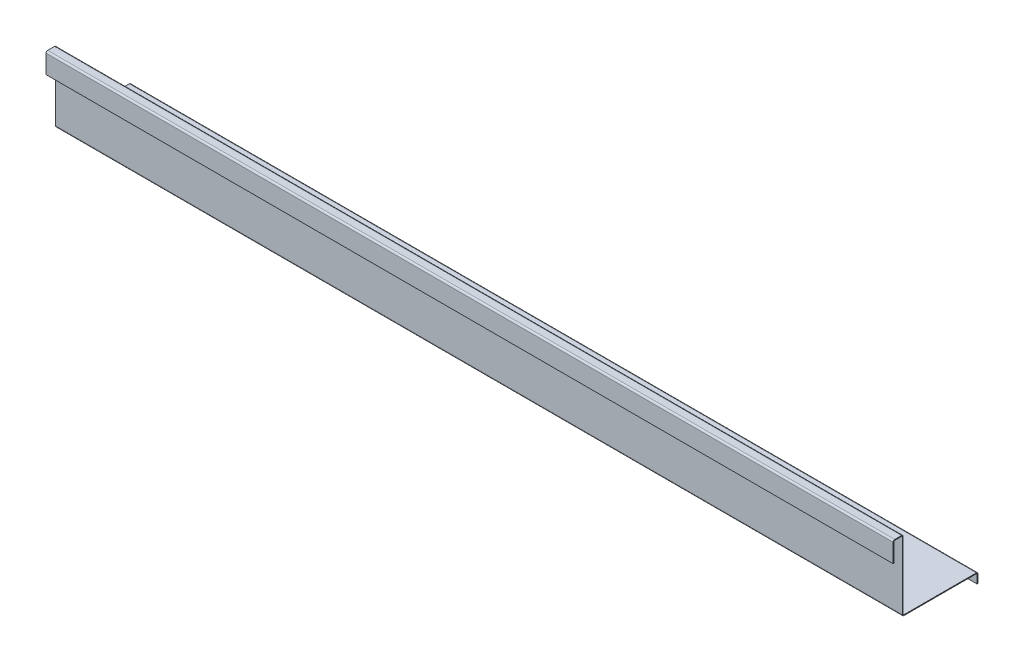
ISO-10303-21;
HEADER;
FILE_DESCRIPTION(('STEP AP214'),'2;1');
FILE_NAME('part.step','',(''),(''),'','','');
FILE_SCHEMA(('AUTOMOTIVE_DESIGN { 1 0 10303 214 1 1 1 1 }'));
ENDSEC;
DATA;
#1=APPLICATION_CONTEXT('core data for automotive mechanical design processes');
#2=APPLICATION_PROTOCOL_DEFINITION('international standard','automotive_design',2000,#1);
#3=PRODUCT_CONTEXT('',#1,'mechanical');
#4=PRODUCT('Part','Part','',(#3));
#5=PRODUCT_RELATED_PRODUCT_CATEGORY('part','',(#4));
#6=PRODUCT_DEFINITION_FORMATION('','',#4);
#7=PRODUCT_DEFINITION_CONTEXT('part definition',#1,'design');
#8=PRODUCT_DEFINITION('design','',#6,#7);
#9=PRODUCT_DEFINITION_SHAPE('','',#8);
#10=(LENGTH_UNIT() NAMED_UNIT(*) SI_UNIT(.MILLI.,.METRE.));
#11=(NAMED_UNIT(*) PLANE_ANGLE_UNIT() SI_UNIT($,.RADIAN.));
#12=(NAMED_UNIT(*) SI_UNIT($,.STERADIAN.) SOLID_ANGLE_UNIT());
#13=UNCERTAINTY_MEASURE_WITH_UNIT(LENGTH_MEASURE(1.E-05),#10,'distance_accuracy_value','');
#14=(GEOMETRIC_REPRESENTATION_CONTEXT(3) GLOBAL_UNCERTAINTY_ASSIGNED_CONTEXT((#13)) GLOBAL_UNIT_ASSIGNED_CONTEXT((#10,
#11,#12)) REPRESENTATION_CONTEXT('',''));
#15=CARTESIAN_POINT('',(0.,0.,0.));
#16=DIRECTION('',(0.,0.,1.));
#17=DIRECTION('',(1.,0.,0.));
#18=AXIS2_PLACEMENT_3D('',#15,#16,#17);
#19=CARTESIAN_POINT('',(420.,-0.8,37.5));
#20=DIRECTION('',(1.,0.,0.));
#21=DIRECTION('',(0.,0.,-1.));
#22=AXIS2_PLACEMENT_3D('',#19,#20,#21);
#23=PLANE('',#22);
#24=DIRECTION('',(0.,0.,-1.));
#25=VECTOR('',#24,1.);
#26=CARTESIAN_POINT('',(420.,-0.8,37.5));
#27=LINE('',#26,#25);
#28=CARTESIAN_POINT('',(420.,-0.8,35.9));
#29=VERTEX_POINT('',#28);
#30=CARTESIAN_POINT('',(420.,-0.8,-35.9));
#31=VERTEX_POINT('',#30);
#32=EDGE_CURVE('E121',#29,#31,#27,.T.);
#33=ORIENTED_EDGE('',*,*,#32,.T.);
#34=DIRECTION('',(0.,1.,0.));
#35=VECTOR('',#34,1.);
#36=CARTESIAN_POINT('',(420.,-0.800000000000008,-35.9));
#37=LINE('',#36,#35);
#38=CARTESIAN_POINT('',(420.,0.,-35.9));
#39=VERTEX_POINT('',#38);
#40=EDGE_CURVE('E300',#31,#39,#37,.T.);
#41=ORIENTED_EDGE('',*,*,#40,.T.);
#42=DIRECTION('',(0.,0.,-1.));
#43=VECTOR('',#42,1.);
#44=CARTESIAN_POINT('',(420.,0.,37.5));
#45=LINE('',#44,#43);
#46=CARTESIAN_POINT('',(420.,0.,35.9));
#47=VERTEX_POINT('',#46);
#48=EDGE_CURVE('E456',#47,#39,#45,.T.);
#49=ORIENTED_EDGE('',*,*,#48,.F.);
#50=DIRECTION('',(0.,-1.,0.));
#51=VECTOR('',#50,1.);
#52=CARTESIAN_POINT('',(420.,0.,35.9));
#53=LINE('',#52,#51);
#54=EDGE_CURVE('E442',#47,#29,#53,.T.);
#55=ORIENTED_EDGE('',*,*,#54,.T.);
#56=EDGE_LOOP('',(#33,#41,#49,#55));
#57=FACE_BOUND('',#56,.T.);
#58=ADVANCED_FACE('F113',(#57),#23,.T.);
#59=CARTESIAN_POINT('',(420.,-0.8,-37.5));
#60=DIRECTION('',(0.,-1.,0.));
#61=DIRECTION('',(0.,0.,-1.));
#62=AXIS2_PLACEMENT_3D('',#59,#60,#61);
#63=PLANE('',#62);
#64=DIRECTION('',(0.,0.,1.));
#65=VECTOR('',#64,1.);
#66=CARTESIAN_POINT('',(-420.,-0.8,37.5));
#67=LINE('',#66,#65);
#68=CARTESIAN_POINT('',(-420.,-0.8,-35.9));
#69=VERTEX_POINT('',#68);
#70=CARTESIAN_POINT('',(-420.,-0.8,35.9));
#71=VERTEX_POINT('',#70);
#72=EDGE_CURVE('E13',#69,#71,#67,.T.);
#73=ORIENTED_EDGE('',*,*,#72,.F.);
#74=DIRECTION('',(1.,0.,0.));
#75=VECTOR('',#74,1.);
#76=CARTESIAN_POINT('',(420.,-0.800000000000008,-35.9));
#77=LINE('',#76,#75);
#78=EDGE_CURVE('E129',#31,#69,#77,.F.);
#79=ORIENTED_EDGE('',*,*,#78,.F.);
#80=ORIENTED_EDGE('',*,*,#32,.F.);
#81=DIRECTION('',(1.,0.,0.));
#82=VECTOR('',#81,1.);
#83=CARTESIAN_POINT('',(420.,-0.8,35.9));
#84=LINE('',#83,#82);
#85=EDGE_CURVE('E435',#29,#71,#84,.F.);
#86=ORIENTED_EDGE('',*,*,#85,.T.);
#87=EDGE_LOOP('',(#73,#79,#80,#86));
#88=FACE_BOUND('',#87,.T.);
#89=ADVANCED_FACE('F540',(#88),#63,.T.);
#90=CARTESIAN_POINT('',(420.,0.,-37.5));
#91=DIRECTION('',(0.,-1.,0.));
#92=DIRECTION('',(0.,0.,-1.));
#93=AXIS2_PLACEMENT_3D('',#90,#91,#92);
#94=PLANE('',#93);
#95=DIRECTION('',(1.,0.,0.));
#96=VECTOR('',#95,1.);
#97=CARTESIAN_POINT('',(420.,0.,-35.9));
#98=LINE('',#97,#96);
#99=CARTESIAN_POINT('',(-420.,0.,-35.9));
#100=VERTEX_POINT('',#99);
#101=EDGE_CURVE('E293',#39,#100,#98,.F.);
#102=ORIENTED_EDGE('',*,*,#101,.T.);
#103=DIRECTION('',(0.,0.,1.));
#104=VECTOR('',#103,1.);
#105=CARTESIAN_POINT('',(-420.,0.,37.5));
#106=LINE('',#105,#104);
#107=CARTESIAN_POINT('',(-420.,0.,35.9));
#108=VERTEX_POINT('',#107);
#109=EDGE_CURVE('E116',#100,#108,#106,.T.);
#110=ORIENTED_EDGE('',*,*,#109,.T.);
#111=DIRECTION('',(1.,0.,0.));
#112=VECTOR('',#111,1.);
#113=CARTESIAN_POINT('',(420.,0.,35.9));
#114=LINE('',#113,#112);
#115=EDGE_CURVE('E448',#47,#108,#114,.F.);
#116=ORIENTED_EDGE('',*,*,#115,.F.);
#117=ORIENTED_EDGE('',*,*,#48,.T.);
#118=EDGE_LOOP('',(#102,#110,#116,#117));
#119=FACE_BOUND('',#118,.T.);
#120=ADVANCED_FACE('F462',(#119),#94,.F.);
#121=CARTESIAN_POINT('',(-420.,69.2,37.5));
#122=DIRECTION('',(-1.,0.,0.));
#123=DIRECTION('',(0.,0.,1.));
#124=AXIS2_PLACEMENT_3D('',#121,#122,#123);
#125=PLANE('',#124);
#126=DIRECTION('',(0.,0.,1.));
#127=VECTOR('',#126,1.);
#128=CARTESIAN_POINT('',(-420.,68.4,37.5));
#129=LINE('',#128,#127);
#130=CARTESIAN_POINT('',(-420.,68.4000000000001,45.1));
#131=VERTEX_POINT('',#130);
#132=CARTESIAN_POINT('',(-420.,68.4,38.3));
#133=VERTEX_POINT('',#132);
#134=EDGE_CURVE('E375',#131,#133,#129,.F.);
#135=ORIENTED_EDGE('',*,*,#134,.F.);
#136=DIRECTION('',(0.,1.,0.));
#137=VECTOR('',#136,1.);
#138=CARTESIAN_POINT('',(-420.,68.4000000000001,45.1));
#139=LINE('',#138,#137);
#140=CARTESIAN_POINT('',(-420.,69.2000000000001,45.1));
#141=VERTEX_POINT('',#140);
#142=EDGE_CURVE('E353',#131,#141,#139,.T.);
#143=ORIENTED_EDGE('',*,*,#142,.T.);
#144=DIRECTION('',(0.,0.,-1.));
#145=VECTOR('',#144,1.);
#146=CARTESIAN_POINT('',(-420.,69.2,37.5));
#147=LINE('',#146,#145);
#148=CARTESIAN_POINT('',(-420.,69.2,38.3));
#149=VERTEX_POINT('',#148);
#150=EDGE_CURVE('E369',#141,#149,#147,.T.);
#151=ORIENTED_EDGE('',*,*,#150,.T.);
#152=DIRECTION('',(0.,1.,0.));
#153=VECTOR('',#152,1.);
#154=CARTESIAN_POINT('',(-420.,68.4,38.3));
#155=LINE('',#154,#153);
#156=EDGE_CURVE('E383',#133,#149,#155,.T.);
#157=ORIENTED_EDGE('',*,*,#156,.F.);
#158=EDGE_LOOP('',(#135,#143,#151,#157));
#159=FACE_BOUND('',#158,.T.);
#160=ADVANCED_FACE('F518',(#159),#125,.T.);
#161=CARTESIAN_POINT('',(-420.,69.2,37.5));
#162=DIRECTION('',(0.,1.,0.));
#163=DIRECTION('',(0.,0.,1.));
#164=AXIS2_PLACEMENT_3D('',#161,#162,#163);
#165=PLANE('',#164);
#166=ORIENTED_EDGE('',*,*,#150,.F.);
#167=DIRECTION('',(-1.,0.,0.));
#168=VECTOR('',#167,1.);
#169=CARTESIAN_POINT('',(-420.,69.2000000000001,45.1));
#170=LINE('',#169,#168);
#171=CARTESIAN_POINT('',(420.,69.2,45.1));
#172=VERTEX_POINT('',#171);
#173=EDGE_CURVE('E346',#141,#172,#170,.F.);
#174=ORIENTED_EDGE('',*,*,#173,.T.);
#175=DIRECTION('',(0.,0.,1.));
#176=VECTOR('',#175,1.);
#177=CARTESIAN_POINT('',(420.,69.2,46.7));
#178=LINE('',#177,#176);
#179=CARTESIAN_POINT('',(420.,69.2,38.3));
#180=VERTEX_POINT('',#179);
#181=EDGE_CURVE('E372',#180,#172,#178,.T.);
#182=ORIENTED_EDGE('',*,*,#181,.F.);
#183=DIRECTION('',(-1.,0.,0.));
#184=VECTOR('',#183,1.);
#185=CARTESIAN_POINT('',(-420.,69.2,38.3));
#186=LINE('',#185,#184);
#187=EDGE_CURVE('E380',#180,#149,#186,.T.);
#188=ORIENTED_EDGE('',*,*,#187,.T.);
#189=EDGE_LOOP('',(#166,#174,#182,#188));
#190=FACE_BOUND('',#189,.T.);
#191=ADVANCED_FACE('F509',(#190),#165,.T.);
#192=CARTESIAN_POINT('',(-420.,68.4,37.5));
#193=DIRECTION('',(0.,1.,0.));
#194=DIRECTION('',(0.,0.,1.));
#195=AXIS2_PLACEMENT_3D('',#192,#193,#194);
#196=PLANE('',#195);
#197=DIRECTION('',(-1.,0.,0.));
#198=VECTOR('',#197,1.);
#199=CARTESIAN_POINT('',(-420.,68.4000000000001,45.1));
#200=LINE('',#199,#198);
#201=CARTESIAN_POINT('',(420.,68.4000000000001,45.1));
#202=VERTEX_POINT('',#201);
#203=EDGE_CURVE('E359',#131,#202,#200,.F.);
#204=ORIENTED_EDGE('',*,*,#203,.F.);
#205=ORIENTED_EDGE('',*,*,#134,.T.);
#206=DIRECTION('',(1.,0.,0.));
#207=VECTOR('',#206,1.);
#208=CARTESIAN_POINT('',(420.,68.4,38.3));
#209=LINE('',#208,#207);
#210=CARTESIAN_POINT('',(420.,68.4,38.3));
#211=VERTEX_POINT('',#210);
#212=EDGE_CURVE('E386',#211,#133,#209,.F.);
#213=ORIENTED_EDGE('',*,*,#212,.F.);
#214=DIRECTION('',(0.,0.,-1.));
#215=VECTOR('',#214,1.);
#216=CARTESIAN_POINT('',(420.,68.4,37.5));
#217=LINE('',#216,#215);
#218=EDGE_CURVE('E377',#211,#202,#217,.F.);
#219=ORIENTED_EDGE('',*,*,#218,.T.);
#220=EDGE_LOOP('',(#204,#205,#213,#219));
#221=FACE_BOUND('',#220,.T.);
#222=ADVANCED_FACE('F523',(#221),#196,.F.);
#223=CARTESIAN_POINT('',(420.,69.2,37.5));
#224=DIRECTION('',(-1.,0.,0.));
#225=DIRECTION('',(0.,0.,1.));
#226=AXIS2_PLACEMENT_3D('',#223,#224,#225);
#227=PLANE('',#226);
#228=DIRECTION('',(0.,0.,-1.));
#229=VECTOR('',#228,1.);
#230=CARTESIAN_POINT('',(420.,67.6,37.5));
#231=LINE('',#230,#229);
#232=CARTESIAN_POINT('',(420.,67.6,37.5));
#233=VERTEX_POINT('',#232);
#234=CARTESIAN_POINT('',(420.,67.6,36.7));
#235=VERTEX_POINT('',#234);
#236=EDGE_CURVE('E408',#233,#235,#231,.T.);
#237=ORIENTED_EDGE('',*,*,#236,.F.);
#238=DIRECTION('',(0.,1.,0.));
#239=VECTOR('',#238,1.);
#240=CARTESIAN_POINT('',(420.,0.,37.5));
#241=LINE('',#240,#239);
#242=CARTESIAN_POINT('',(420.,0.800000000000009,37.5));
#243=VERTEX_POINT('',#242);
#244=EDGE_CURVE('E417',#243,#233,#241,.T.);
#245=ORIENTED_EDGE('',*,*,#244,.F.);
#246=DIRECTION('',(0.,0.,-1.));
#247=VECTOR('',#246,1.);
#248=CARTESIAN_POINT('',(420.,0.800000000000009,36.7));
#249=LINE('',#248,#247);
#250=CARTESIAN_POINT('',(420.,0.800000000000002,36.7));
#251=VERTEX_POINT('',#250);
#252=EDGE_CURVE('E428',#251,#243,#249,.F.);
#253=ORIENTED_EDGE('',*,*,#252,.F.);
#254=DIRECTION('',(0.,-1.,0.));
#255=VECTOR('',#254,1.);
#256=CARTESIAN_POINT('',(420.,69.2,36.7));
#257=LINE('',#256,#255);
#258=EDGE_CURVE('E422',#251,#235,#257,.F.);
#259=ORIENTED_EDGE('',*,*,#258,.T.);
#260=EDGE_LOOP('',(#237,#245,#253,#259));
#261=FACE_BOUND('',#260,.T.);
#262=ADVANCED_FACE('F491',(#261),#227,.F.);
#263=CARTESIAN_POINT('',(-420.,0.,37.5));
#264=DIRECTION('',(1.,0.,0.));
#265=DIRECTION('',(0.,0.,-1.));
#266=AXIS2_PLACEMENT_3D('',#263,#264,#265);
#267=PLANE('',#266);
#268=DIRECTION('',(0.,0.,-1.));
#269=VECTOR('',#268,1.);
#270=CARTESIAN_POINT('',(-420.,67.6,37.5));
#271=LINE('',#270,#269);
#272=CARTESIAN_POINT('',(-420.,67.6,37.5));
#273=VERTEX_POINT('',#272);
#274=CARTESIAN_POINT('',(-420.,67.6,36.7));
#275=VERTEX_POINT('',#274);
#276=EDGE_CURVE('E398',#273,#275,#271,.T.);
#277=ORIENTED_EDGE('',*,*,#276,.T.);
#278=DIRECTION('',(0.,1.,0.));
#279=VECTOR('',#278,1.);
#280=CARTESIAN_POINT('',(-420.,0.,36.7));
#281=LINE('',#280,#279);
#282=CARTESIAN_POINT('',(-420.,0.800000000000002,36.7));
#283=VERTEX_POINT('',#282);
#284=EDGE_CURVE('E420',#275,#283,#281,.F.);
#285=ORIENTED_EDGE('',*,*,#284,.T.);
#286=DIRECTION('',(0.,0.,-1.));
#287=VECTOR('',#286,1.);
#288=CARTESIAN_POINT('',(-420.,0.799999999999995,37.5));
#289=LINE('',#288,#287);
#290=CARTESIAN_POINT('',(-420.,0.800000000000002,37.5));
#291=VERTEX_POINT('',#290);
#292=EDGE_CURVE('E411',#283,#291,#289,.F.);
#293=ORIENTED_EDGE('',*,*,#292,.T.);
#294=DIRECTION('',(0.,-1.,0.));
#295=VECTOR('',#294,1.);
#296=CARTESIAN_POINT('',(-420.,0.,37.5));
#297=LINE('',#296,#295);
#298=EDGE_CURVE('E414',#273,#291,#297,.T.);
#299=ORIENTED_EDGE('',*,*,#298,.F.);
#300=EDGE_LOOP('',(#277,#285,#293,#299));
#301=FACE_BOUND('',#300,.T.);
#302=ADVANCED_FACE('F480',(#301),#267,.F.);
#303=CARTESIAN_POINT('',(420.,0.,37.5));
#304=DIRECTION('',(0.,0.,-1.));
#305=DIRECTION('',(-1.,0.,0.));
#306=AXIS2_PLACEMENT_3D('',#303,#304,#305);
#307=PLANE('',#306);
#308=DIRECTION('',(-1.,0.,0.));
#309=VECTOR('',#308,1.);
#310=CARTESIAN_POINT('',(-420.,67.6,37.5));
#311=LINE('',#310,#309);
#312=EDGE_CURVE('E404',#273,#233,#311,.F.);
#313=ORIENTED_EDGE('',*,*,#312,.F.);
#314=ORIENTED_EDGE('',*,*,#298,.T.);
#315=DIRECTION('',(1.,0.,0.));
#316=VECTOR('',#315,1.);
#317=CARTESIAN_POINT('',(-420.,0.799999999999995,37.5));
#318=LINE('',#317,#316);
#319=EDGE_CURVE('E425',#243,#291,#318,.F.);
#320=ORIENTED_EDGE('',*,*,#319,.F.);
#321=ORIENTED_EDGE('',*,*,#244,.T.);
#322=EDGE_LOOP('',(#313,#314,#320,#321));
#323=FACE_BOUND('',#322,.T.);
#324=ADVANCED_FACE('F494',(#323),#307,.F.);
#325=CARTESIAN_POINT('',(420.,0.,36.7));
#326=DIRECTION('',(0.,0.,-1.));
#327=DIRECTION('',(-1.,0.,0.));
#328=AXIS2_PLACEMENT_3D('',#325,#326,#327);
#329=PLANE('',#328);
#330=ORIENTED_EDGE('',*,*,#284,.F.);
#331=DIRECTION('',(-1.,0.,0.));
#332=VECTOR('',#331,1.);
#333=CARTESIAN_POINT('',(-420.,67.6,36.7));
#334=LINE('',#333,#332);
#335=EDGE_CURVE('E391',#275,#235,#334,.F.);
#336=ORIENTED_EDGE('',*,*,#335,.T.);
#337=ORIENTED_EDGE('',*,*,#258,.F.);
#338=DIRECTION('',(1.,0.,0.));
#339=VECTOR('',#338,1.);
#340=CARTESIAN_POINT('',(-420.,0.799999999999995,36.7));
#341=LINE('',#340,#339);
#342=EDGE_CURVE('E431',#283,#251,#341,.T.);
#343=ORIENTED_EDGE('',*,*,#342,.F.);
#344=EDGE_LOOP('',(#330,#336,#337,#343));
#345=FACE_BOUND('',#344,.T.);
#346=ADVANCED_FACE('F483',(#345),#329,.T.);
#347=CARTESIAN_POINT('',(-420.,-0.8,37.5));
#348=DIRECTION('',(-1.,0.,0.));
#349=DIRECTION('',(0.,0.,1.));
#350=AXIS2_PLACEMENT_3D('',#347,#348,#349);
#351=PLANE('',#350);
#352=DIRECTION('',(0.,1.,0.));
#353=VECTOR('',#352,1.);
#354=CARTESIAN_POINT('',(-420.,-0.800000000000008,-35.9));
#355=LINE('',#354,#353);
#356=EDGE_CURVE('E136',#69,#100,#355,.T.);
#357=ORIENTED_EDGE('',*,*,#356,.F.);
#358=ORIENTED_EDGE('',*,*,#72,.T.);
#359=DIRECTION('',(0.,-1.,0.));
#360=VECTOR('',#359,1.);
#361=CARTESIAN_POINT('',(-420.,0.,35.9));
#362=LINE('',#361,#360);
#363=EDGE_CURVE('E453',#108,#71,#362,.T.);
#364=ORIENTED_EDGE('',*,*,#363,.F.);
#365=ORIENTED_EDGE('',*,*,#109,.F.);
#366=EDGE_LOOP('',(#357,#358,#364,#365));
#367=FACE_BOUND('',#366,.T.);
#368=ADVANCED_FACE('F473',(#367),#351,.T.);
#369=CARTESIAN_POINT('',(-420.,0.800000000000002,35.9));
#370=DIRECTION('',(-1.,0.,0.));
#371=DIRECTION('',(0.,0.,1.));
#372=AXIS2_PLACEMENT_3D('',#369,#370,#371);
#373=PLANE('',#372);
#374=ORIENTED_EDGE('',*,*,#292,.F.);
#375=CARTESIAN_POINT('',(-420.,0.800000000000002,35.9));
#376=DIRECTION('',(1.,0.,0.));
#377=DIRECTION('',(0.,0.,-1.));
#378=AXIS2_PLACEMENT_3D('',#375,#376,#377);
#379=CIRCLE('',#378,0.800000000000002);
#380=EDGE_CURVE('E445',#108,#283,#379,.F.);
#381=ORIENTED_EDGE('',*,*,#380,.F.);
#382=ORIENTED_EDGE('',*,*,#363,.T.);
#383=CARTESIAN_POINT('',(-420.,0.800000000000002,35.9));
#384=DIRECTION('',(1.,0.,0.));
#385=DIRECTION('',(0.,0.,-1.));
#386=AXIS2_PLACEMENT_3D('',#383,#384,#385);
#387=CIRCLE('',#386,1.6);
#388=EDGE_CURVE('E438',#71,#291,#387,.F.);
#389=ORIENTED_EDGE('',*,*,#388,.T.);
#390=EDGE_LOOP('',(#374,#381,#382,#389));
#391=FACE_BOUND('',#390,.T.);
#392=ADVANCED_FACE('F472',(#391),#373,.T.);
#393=CARTESIAN_POINT('',(420.,0.800000000000002,35.9));
#394=DIRECTION('',(-1.,0.,0.));
#395=DIRECTION('',(0.,0.,1.));
#396=AXIS2_PLACEMENT_3D('',#393,#394,#395);
#397=PLANE('',#396);
#398=CARTESIAN_POINT('',(420.,0.800000000000002,35.9));
#399=DIRECTION('',(1.,0.,0.));
#400=DIRECTION('',(0.,0.,-1.));
#401=AXIS2_PLACEMENT_3D('',#398,#399,#400);
#402=CIRCLE('',#401,0.800000000000002);
#403=EDGE_CURVE('E416',#251,#47,#402,.T.);
#404=ORIENTED_EDGE('',*,*,#403,.F.);
#405=ORIENTED_EDGE('',*,*,#252,.T.);
#406=CARTESIAN_POINT('',(420.,0.800000000000002,35.9));
#407=DIRECTION('',(1.,0.,0.));
#408=DIRECTION('',(0.,0.,-1.));
#409=AXIS2_PLACEMENT_3D('',#406,#407,#408);
#410=CIRCLE('',#409,1.6);
#411=EDGE_CURVE('E439',#243,#29,#410,.T.);
#412=ORIENTED_EDGE('',*,*,#411,.T.);
#413=ORIENTED_EDGE('',*,*,#54,.F.);
#414=EDGE_LOOP('',(#404,#405,#412,#413));
#415=FACE_BOUND('',#414,.T.);
#416=ADVANCED_FACE('F487',(#415),#397,.F.);
#417=CARTESIAN_POINT('',(420.,0.800000000000002,35.9));
#418=DIRECTION('',(1.,0.,0.));
#419=DIRECTION('',(0.,0.,1.));
#420=AXIS2_PLACEMENT_3D('',#417,#418,#419);
#421=CYLINDRICAL_SURFACE('',#420,1.6);
#422=ORIENTED_EDGE('',*,*,#85,.F.);
#423=ORIENTED_EDGE('',*,*,#411,.F.);
#424=ORIENTED_EDGE('',*,*,#319,.T.);
#425=ORIENTED_EDGE('',*,*,#388,.F.);
#426=EDGE_LOOP('',(#422,#423,#424,#425));
#427=FACE_BOUND('',#426,.T.);
#428=ADVANCED_FACE('F476',(#427),#421,.T.);
#429=CARTESIAN_POINT('',(420.,0.800000000000002,35.9));
#430=DIRECTION('',(1.,0.,0.));
#431=DIRECTION('',(0.,0.,1.));
#432=AXIS2_PLACEMENT_3D('',#429,#430,#431);
#433=CYLINDRICAL_SURFACE('',#432,0.800000000000002);
#434=ORIENTED_EDGE('',*,*,#115,.T.);
#435=ORIENTED_EDGE('',*,*,#380,.T.);
#436=ORIENTED_EDGE('',*,*,#342,.T.);
#437=ORIENTED_EDGE('',*,*,#403,.T.);
#438=EDGE_LOOP('',(#434,#435,#436,#437));
#439=FACE_BOUND('',#438,.T.);
#440=ADVANCED_FACE('F467',(#439),#433,.F.);
#441=CARTESIAN_POINT('',(420.,67.6,38.3));
#442=DIRECTION('',(1.,0.,0.));
#443=DIRECTION('',(0.,0.,-1.));
#444=AXIS2_PLACEMENT_3D('',#441,#442,#443);
#445=PLANE('',#444);
#446=DIRECTION('',(0.,1.,0.));
#447=VECTOR('',#446,1.);
#448=CARTESIAN_POINT('',(420.,69.2,38.3));
#449=LINE('',#448,#447);
#450=EDGE_CURVE('E366',#211,#180,#449,.T.);
#451=ORIENTED_EDGE('',*,*,#450,.F.);
#452=CARTESIAN_POINT('',(420.,67.6,38.3));
#453=DIRECTION('',(-1.,0.,0.));
#454=DIRECTION('',(0.,0.,1.));
#455=AXIS2_PLACEMENT_3D('',#452,#453,#454);
#456=CIRCLE('',#455,0.799999999999995);
#457=EDGE_CURVE('E401',#233,#211,#456,.F.);
#458=ORIENTED_EDGE('',*,*,#457,.F.);
#459=ORIENTED_EDGE('',*,*,#236,.T.);
#460=CARTESIAN_POINT('',(420.,67.6,38.3));
#461=DIRECTION('',(-1.,0.,0.));
#462=DIRECTION('',(0.,0.,1.));
#463=AXIS2_PLACEMENT_3D('',#460,#461,#462);
#464=CIRCLE('',#463,1.59999999999999);
#465=EDGE_CURVE('E394',#235,#180,#464,.F.);
#466=ORIENTED_EDGE('',*,*,#465,.T.);
#467=EDGE_LOOP('',(#451,#458,#459,#466));
#468=FACE_BOUND('',#467,.T.);
#469=ADVANCED_FACE('F501',(#468),#445,.T.);
#470=CARTESIAN_POINT('',(-420.,67.6,38.3));
#471=DIRECTION('',(1.,0.,0.));
#472=DIRECTION('',(0.,0.,-1.));
#473=AXIS2_PLACEMENT_3D('',#470,#471,#472);
#474=PLANE('',#473);
#475=CARTESIAN_POINT('',(-420.,67.6,38.3));
#476=DIRECTION('',(-1.,0.,0.));
#477=DIRECTION('',(0.,0.,1.));
#478=AXIS2_PLACEMENT_3D('',#475,#476,#477);
#479=CIRCLE('',#478,0.799999999999995);
#480=EDGE_CURVE('E371',#133,#273,#479,.T.);
#481=ORIENTED_EDGE('',*,*,#480,.F.);
#482=ORIENTED_EDGE('',*,*,#156,.T.);
#483=CARTESIAN_POINT('',(-420.,67.6,38.3));
#484=DIRECTION('',(-1.,0.,0.));
#485=DIRECTION('',(0.,0.,1.));
#486=AXIS2_PLACEMENT_3D('',#483,#484,#485);
#487=CIRCLE('',#486,1.59999999999999);
#488=EDGE_CURVE('E395',#149,#275,#487,.T.);
#489=ORIENTED_EDGE('',*,*,#488,.T.);
#490=ORIENTED_EDGE('',*,*,#276,.F.);
#491=EDGE_LOOP('',(#481,#482,#489,#490));
#492=FACE_BOUND('',#491,.T.);
#493=ADVANCED_FACE('F525',(#492),#474,.F.);
#494=CARTESIAN_POINT('',(-420.,67.6,38.3));
#495=DIRECTION('',(-1.,0.,0.));
#496=DIRECTION('',(0.,1.,0.));
#497=AXIS2_PLACEMENT_3D('',#494,#495,#496);
#498=CYLINDRICAL_SURFACE('',#497,1.59999999999999);
#499=ORIENTED_EDGE('',*,*,#335,.F.);
#500=ORIENTED_EDGE('',*,*,#488,.F.);
#501=ORIENTED_EDGE('',*,*,#187,.F.);
#502=ORIENTED_EDGE('',*,*,#465,.F.);
#503=EDGE_LOOP('',(#499,#500,#501,#502));
#504=FACE_BOUND('',#503,.T.);
#505=ADVANCED_FACE('F527',(#504),#498,.T.);
#506=CARTESIAN_POINT('',(-420.,67.6,38.3));
#507=DIRECTION('',(-1.,0.,0.));
#508=DIRECTION('',(0.,1.,0.));
#509=AXIS2_PLACEMENT_3D('',#506,#507,#508);
#510=CYLINDRICAL_SURFACE('',#509,0.799999999999995);
#511=ORIENTED_EDGE('',*,*,#312,.T.);
#512=ORIENTED_EDGE('',*,*,#457,.T.);
#513=ORIENTED_EDGE('',*,*,#212,.T.);
#514=ORIENTED_EDGE('',*,*,#480,.T.);
#515=EDGE_LOOP('',(#511,#512,#513,#514));
#516=FACE_BOUND('',#515,.T.);
#517=ADVANCED_FACE('F497',(#516),#510,.F.);
#518=CARTESIAN_POINT('',(420.,69.2,46.7));
#519=DIRECTION('',(1.,0.,0.));
#520=DIRECTION('',(0.,0.,-1.));
#521=AXIS2_PLACEMENT_3D('',#518,#519,#520);
#522=PLANE('',#521);
#523=DIRECTION('',(0.,1.,0.));
#524=VECTOR('',#523,1.);
#525=CARTESIAN_POINT('',(420.,68.4000000000001,45.1));
#526=LINE('',#525,#524);
#527=EDGE_CURVE('E363',#202,#172,#526,.T.);
#528=ORIENTED_EDGE('',*,*,#527,.F.);
#529=ORIENTED_EDGE('',*,*,#218,.F.);
#530=ORIENTED_EDGE('',*,*,#450,.T.);
#531=ORIENTED_EDGE('',*,*,#181,.T.);
#532=EDGE_LOOP('',(#528,#529,#530,#531));
#533=FACE_BOUND('',#532,.T.);
#534=ADVANCED_FACE('F506',(#533),#522,.T.);
#535=CARTESIAN_POINT('',(420.,67.6000000000001,45.1));
#536=DIRECTION('',(1.,0.,0.));
#537=DIRECTION('',(0.,0.,-1.));
#538=AXIS2_PLACEMENT_3D('',#535,#536,#537);
#539=PLANE('',#538);
#540=DIRECTION('',(0.,0.,1.));
#541=VECTOR('',#540,1.);
#542=CARTESIAN_POINT('',(420.,67.6000000000001,46.7000000000001));
#543=LINE('',#542,#541);
#544=CARTESIAN_POINT('',(420.,67.6000000000001,45.9));
#545=VERTEX_POINT('',#544);
#546=CARTESIAN_POINT('',(420.,67.6000000000001,46.7));
#547=VERTEX_POINT('',#546);
#548=EDGE_CURVE('E311',#545,#547,#543,.T.);
#549=ORIENTED_EDGE('',*,*,#548,.F.);
#550=CARTESIAN_POINT('',(420.,67.6000000000001,45.1));
#551=DIRECTION('',(-1.,0.,0.));
#552=DIRECTION('',(0.,0.,1.));
#553=AXIS2_PLACEMENT_3D('',#550,#551,#552);
#554=CIRCLE('',#553,0.800000000000002);
#555=EDGE_CURVE('E356',#202,#545,#554,.F.);
#556=ORIENTED_EDGE('',*,*,#555,.F.);
#557=ORIENTED_EDGE('',*,*,#527,.T.);
#558=CARTESIAN_POINT('',(420.,67.6000000000001,45.1));
#559=DIRECTION('',(-1.,0.,0.));
#560=DIRECTION('',(0.,0.,1.));
#561=AXIS2_PLACEMENT_3D('',#558,#559,#560);
#562=CIRCLE('',#561,1.6);
#563=EDGE_CURVE('E349',#172,#547,#562,.F.);
#564=ORIENTED_EDGE('',*,*,#563,.T.);
#565=EDGE_LOOP('',(#549,#556,#557,#564));
#566=FACE_BOUND('',#565,.T.);
#567=ADVANCED_FACE('F749',(#566),#539,.T.);
#568=CARTESIAN_POINT('',(-420.,67.6000000000001,45.1));
#569=DIRECTION('',(1.,0.,0.));
#570=DIRECTION('',(0.,0.,-1.));
#571=AXIS2_PLACEMENT_3D('',#568,#569,#570);
#572=PLANE('',#571);
#573=CARTESIAN_POINT('',(-420.,67.6000000000001,45.1));
#574=DIRECTION('',(-1.,0.,0.));
#575=DIRECTION('',(0.,0.,1.));
#576=AXIS2_PLACEMENT_3D('',#573,#574,#575);
#577=CIRCLE('',#576,0.800000000000002);
#578=CARTESIAN_POINT('',(-420.,67.6000000000001,45.9));
#579=VERTEX_POINT('',#578);
#580=EDGE_CURVE('E316',#579,#131,#577,.T.);
#581=ORIENTED_EDGE('',*,*,#580,.F.);
#582=DIRECTION('',(0.,0.,1.));
#583=VECTOR('',#582,1.);
#584=CARTESIAN_POINT('',(-420.,67.6000000000001,45.9));
#585=LINE('',#584,#583);
#586=CARTESIAN_POINT('',(-420.,67.6000000000001,46.7));
#587=VERTEX_POINT('',#586);
#588=EDGE_CURVE('E339',#579,#587,#585,.T.);
#589=ORIENTED_EDGE('',*,*,#588,.T.);
#590=CARTESIAN_POINT('',(-420.,67.6000000000001,45.1));
#591=DIRECTION('',(-1.,0.,0.));
#592=DIRECTION('',(0.,0.,1.));
#593=AXIS2_PLACEMENT_3D('',#590,#591,#592);
#594=CIRCLE('',#593,1.6);
#595=EDGE_CURVE('E350',#587,#141,#594,.T.);
#596=ORIENTED_EDGE('',*,*,#595,.T.);
#597=ORIENTED_EDGE('',*,*,#142,.F.);
#598=EDGE_LOOP('',(#581,#589,#596,#597));
#599=FACE_BOUND('',#598,.T.);
#600=ADVANCED_FACE('F514',(#599),#572,.F.);
#601=CARTESIAN_POINT('',(-420.,67.6000000000001,45.1));
#602=DIRECTION('',(-1.,0.,0.));
#603=DIRECTION('',(0.,0.,1.));
#604=AXIS2_PLACEMENT_3D('',#601,#602,#603);
#605=CYLINDRICAL_SURFACE('',#604,1.6);
#606=ORIENTED_EDGE('',*,*,#173,.F.);
#607=ORIENTED_EDGE('',*,*,#595,.F.);
#608=DIRECTION('',(-1.,0.,0.));
#609=VECTOR('',#608,1.);
#610=CARTESIAN_POINT('',(-420.,67.6000000000001,46.7));
#611=LINE('',#610,#609);
#612=EDGE_CURVE('E336',#547,#587,#611,.T.);
#613=ORIENTED_EDGE('',*,*,#612,.F.);
#614=ORIENTED_EDGE('',*,*,#563,.F.);
#615=EDGE_LOOP('',(#606,#607,#613,#614));
#616=FACE_BOUND('',#615,.T.);
#617=ADVANCED_FACE('F511',(#616),#605,.T.);
#618=CARTESIAN_POINT('',(-420.,67.6000000000001,45.1));
#619=DIRECTION('',(-1.,0.,0.));
#620=DIRECTION('',(0.,0.,1.));
#621=AXIS2_PLACEMENT_3D('',#618,#619,#620);
#622=CYLINDRICAL_SURFACE('',#621,0.800000000000002);
#623=ORIENTED_EDGE('',*,*,#203,.T.);
#624=ORIENTED_EDGE('',*,*,#555,.T.);
#625=DIRECTION('',(1.,0.,0.));
#626=VECTOR('',#625,1.);
#627=CARTESIAN_POINT('',(420.,67.6000000000001,45.9));
#628=LINE('',#627,#626);
#629=EDGE_CURVE('E342',#545,#579,#628,.F.);
#630=ORIENTED_EDGE('',*,*,#629,.T.);
#631=ORIENTED_EDGE('',*,*,#580,.T.);
#632=EDGE_LOOP('',(#623,#624,#630,#631));
#633=FACE_BOUND('',#632,.T.);
#634=ADVANCED_FACE('F727',(#633),#622,.F.);
#635=CARTESIAN_POINT('',(-420.,68.4,46.7));
#636=DIRECTION('',(-1.,0.,0.));
#637=DIRECTION('',(0.,0.,1.));
#638=AXIS2_PLACEMENT_3D('',#635,#636,#637);
#639=PLANE('',#638);
#640=DIRECTION('',(0.,1.,0.));
#641=VECTOR('',#640,1.);
#642=CARTESIAN_POINT('',(-420.,68.4,46.7));
#643=LINE('',#642,#641);
#644=CARTESIAN_POINT('',(-420.,49.2000000000001,46.7000000000001));
#645=VERTEX_POINT('',#644);
#646=EDGE_CURVE('E320',#645,#587,#643,.T.);
#647=ORIENTED_EDGE('',*,*,#646,.T.);
#648=ORIENTED_EDGE('',*,*,#588,.F.);
#649=DIRECTION('',(0.,-1.,0.));
#650=VECTOR('',#649,1.);
#651=CARTESIAN_POINT('',(-420.,68.4,45.9));
#652=LINE('',#651,#650);
#653=CARTESIAN_POINT('',(-420.,49.2,45.9000000000001));
#654=VERTEX_POINT('',#653);
#655=EDGE_CURVE('E328',#654,#579,#652,.F.);
#656=ORIENTED_EDGE('',*,*,#655,.F.);
#657=DIRECTION('',(0.,0.,-1.));
#658=VECTOR('',#657,1.);
#659=CARTESIAN_POINT('',(-420.,49.2000000000001,46.7000000000001));
#660=LINE('',#659,#658);
#661=EDGE_CURVE('E314',#645,#654,#660,.T.);
#662=ORIENTED_EDGE('',*,*,#661,.F.);
#663=EDGE_LOOP('',(#647,#648,#656,#662));
#664=FACE_BOUND('',#663,.T.);
#665=ADVANCED_FACE('F716',(#664),#639,.T.);
#666=CARTESIAN_POINT('',(420.,49.2000000000001,46.7000000000001));
#667=DIRECTION('',(1.,0.,0.));
#668=DIRECTION('',(0.,0.,-1.));
#669=AXIS2_PLACEMENT_3D('',#666,#667,#668);
#670=PLANE('',#669);
#671=DIRECTION('',(0.,1.,0.));
#672=VECTOR('',#671,1.);
#673=CARTESIAN_POINT('',(420.,68.4,45.9));
#674=LINE('',#673,#672);
#675=CARTESIAN_POINT('',(420.,49.2,45.9000000000001));
#676=VERTEX_POINT('',#675);
#677=EDGE_CURVE('E334',#545,#676,#674,.F.);
#678=ORIENTED_EDGE('',*,*,#677,.F.);
#679=ORIENTED_EDGE('',*,*,#548,.T.);
#680=DIRECTION('',(0.,-1.,0.));
#681=VECTOR('',#680,1.);
#682=CARTESIAN_POINT('',(420.,49.2000000000001,46.7000000000001));
#683=LINE('',#682,#681);
#684=CARTESIAN_POINT('',(420.,49.2000000000001,46.7000000000001));
#685=VERTEX_POINT('',#684);
#686=EDGE_CURVE('E326',#547,#685,#683,.T.);
#687=ORIENTED_EDGE('',*,*,#686,.T.);
#688=DIRECTION('',(0.,0.,-1.));
#689=VECTOR('',#688,1.);
#690=CARTESIAN_POINT('',(420.,49.2000000000001,46.7000000000001));
#691=LINE('',#690,#689);
#692=EDGE_CURVE('E317',#685,#676,#691,.T.);
#693=ORIENTED_EDGE('',*,*,#692,.T.);
#694=EDGE_LOOP('',(#678,#679,#687,#693));
#695=FACE_BOUND('',#694,.T.);
#696=ADVANCED_FACE('F705',(#695),#670,.T.);
#697=CARTESIAN_POINT('',(-420.,68.4,46.7));
#698=DIRECTION('',(0.,0.,1.));
#699=DIRECTION('',(0.,-1.,0.));
#700=AXIS2_PLACEMENT_3D('',#697,#698,#699);
#701=PLANE('',#700);
#702=ORIENTED_EDGE('',*,*,#686,.F.);
#703=ORIENTED_EDGE('',*,*,#612,.T.);
#704=ORIENTED_EDGE('',*,*,#646,.F.);
#705=DIRECTION('',(-1.,0.,0.));
#706=VECTOR('',#705,1.);
#707=CARTESIAN_POINT('',(-420.,49.2000000000001,46.7000000000001));
#708=LINE('',#707,#706);
#709=EDGE_CURVE('E323',#685,#645,#708,.T.);
#710=ORIENTED_EDGE('',*,*,#709,.F.);
#711=EDGE_LOOP('',(#702,#703,#704,#710));
#712=FACE_BOUND('',#711,.T.);
#713=ADVANCED_FACE('F694',(#712),#701,.T.);
#714=CARTESIAN_POINT('',(-420.,68.4,45.9));
#715=DIRECTION('',(0.,0.,1.));
#716=DIRECTION('',(0.,-1.,0.));
#717=AXIS2_PLACEMENT_3D('',#714,#715,#716);
#718=PLANE('',#717);
#719=ORIENTED_EDGE('',*,*,#629,.F.);
#720=ORIENTED_EDGE('',*,*,#677,.T.);
#721=DIRECTION('',(1.,0.,0.));
#722=VECTOR('',#721,1.);
#723=CARTESIAN_POINT('',(-420.,49.2,45.9000000000001));
#724=LINE('',#723,#722);
#725=EDGE_CURVE('E331',#676,#654,#724,.F.);
#726=ORIENTED_EDGE('',*,*,#725,.T.);
#727=ORIENTED_EDGE('',*,*,#655,.T.);
#728=EDGE_LOOP('',(#719,#720,#726,#727));
#729=FACE_BOUND('',#728,.T.);
#730=ADVANCED_FACE('F573',(#729),#718,.F.);
#731=CARTESIAN_POINT('',(-420.,49.2000000000001,46.7000000000001));
#732=DIRECTION('',(0.,-1.,0.));
#733=DIRECTION('',(0.,0.,-1.));
#734=AXIS2_PLACEMENT_3D('',#731,#732,#733);
#735=PLANE('',#734);
#736=ORIENTED_EDGE('',*,*,#725,.F.);
#737=ORIENTED_EDGE('',*,*,#692,.F.);
#738=ORIENTED_EDGE('',*,*,#709,.T.);
#739=ORIENTED_EDGE('',*,*,#661,.T.);
#740=EDGE_LOOP('',(#736,#737,#738,#739));
#741=FACE_BOUND('',#740,.T.);
#742=ADVANCED_FACE('F566',(#741),#735,.T.);
#743=CARTESIAN_POINT('',(-420.,-1.60000000000001,-35.9));
#744=DIRECTION('',(-1.,0.,0.));
#745=DIRECTION('',(0.,0.,1.));
#746=AXIS2_PLACEMENT_3D('',#743,#744,#745);
#747=PLANE('',#746);
#748=DIRECTION('',(0.,0.,1.));
#749=VECTOR('',#748,1.);
#750=CARTESIAN_POINT('',(-420.,-1.59999999999999,-37.5));
#751=LINE('',#750,#749);
#752=CARTESIAN_POINT('',(-420.,-1.60000000000001,-36.7));
#753=VERTEX_POINT('',#752);
#754=CARTESIAN_POINT('',(-420.,-1.6,-37.5));
#755=VERTEX_POINT('',#754);
#756=EDGE_CURVE('E275',#753,#755,#751,.F.);
#757=ORIENTED_EDGE('',*,*,#756,.F.);
#758=CARTESIAN_POINT('',(-420.,-1.60000000000001,-35.9));
#759=DIRECTION('',(1.,0.,0.));
#760=DIRECTION('',(0.,0.,-1.));
#761=AXIS2_PLACEMENT_3D('',#758,#759,#760);
#762=CIRCLE('',#761,0.800000000000002);
#763=EDGE_CURVE('E303',#69,#753,#762,.F.);
#764=ORIENTED_EDGE('',*,*,#763,.F.);
#765=ORIENTED_EDGE('',*,*,#356,.T.);
#766=CARTESIAN_POINT('',(-420.,-1.60000000000001,-35.9));
#767=DIRECTION('',(1.,0.,0.));
#768=DIRECTION('',(0.,0.,-1.));
#769=AXIS2_PLACEMENT_3D('',#766,#767,#768);
#770=CIRCLE('',#769,1.6);
#771=EDGE_CURVE('E296',#100,#755,#770,.F.);
#772=ORIENTED_EDGE('',*,*,#771,.T.);
#773=EDGE_LOOP('',(#757,#764,#765,#772));
#774=FACE_BOUND('',#773,.T.);
#775=ADVANCED_FACE('F564',(#774),#747,.T.);
#776=CARTESIAN_POINT('',(420.,-1.60000000000001,-35.9));
#777=DIRECTION('',(-1.,0.,0.));
#778=DIRECTION('',(0.,0.,1.));
#779=AXIS2_PLACEMENT_3D('',#776,#777,#778);
#780=PLANE('',#779);
#781=CARTESIAN_POINT('',(420.,-1.60000000000001,-35.9));
#782=DIRECTION('',(1.,0.,0.));
#783=DIRECTION('',(0.,0.,-1.));
#784=AXIS2_PLACEMENT_3D('',#781,#782,#783);
#785=CIRCLE('',#784,0.800000000000002);
#786=CARTESIAN_POINT('',(420.,-1.60000000000001,-36.7));
#787=VERTEX_POINT('',#786);
#788=EDGE_CURVE('E307',#787,#31,#785,.T.);
#789=ORIENTED_EDGE('',*,*,#788,.F.);
#790=DIRECTION('',(0.,0.,1.));
#791=VECTOR('',#790,1.);
#792=CARTESIAN_POINT('',(420.,-1.60000000000001,-36.7));
#793=LINE('',#792,#791);
#794=CARTESIAN_POINT('',(420.,-1.60000000000001,-37.5));
#795=VERTEX_POINT('',#794);
#796=EDGE_CURVE('E287',#787,#795,#793,.F.);
#797=ORIENTED_EDGE('',*,*,#796,.T.);
#798=CARTESIAN_POINT('',(420.,-1.60000000000001,-35.9));
#799=DIRECTION('',(1.,0.,0.));
#800=DIRECTION('',(0.,0.,-1.));
#801=AXIS2_PLACEMENT_3D('',#798,#799,#800);
#802=CIRCLE('',#801,1.6);
#803=EDGE_CURVE('E297',#795,#39,#802,.T.);
#804=ORIENTED_EDGE('',*,*,#803,.T.);
#805=ORIENTED_EDGE('',*,*,#40,.F.);
#806=EDGE_LOOP('',(#789,#797,#804,#805));
#807=FACE_BOUND('',#806,.T.);
#808=ADVANCED_FACE('F549',(#807),#780,.F.);
#809=CARTESIAN_POINT('',(420.,-1.60000000000001,-35.9));
#810=DIRECTION('',(1.,0.,0.));
#811=DIRECTION('',(0.,0.,-1.));
#812=AXIS2_PLACEMENT_3D('',#809,#810,#811);
#813=CYLINDRICAL_SURFACE('',#812,1.6);
#814=ORIENTED_EDGE('',*,*,#101,.F.);
#815=ORIENTED_EDGE('',*,*,#803,.F.);
#816=DIRECTION('',(1.,0.,0.));
#817=VECTOR('',#816,1.);
#818=CARTESIAN_POINT('',(-420.,-1.59999999999999,-37.5));
#819=LINE('',#818,#817);
#820=EDGE_CURVE('E285',#795,#755,#819,.F.);
#821=ORIENTED_EDGE('',*,*,#820,.T.);
#822=ORIENTED_EDGE('',*,*,#771,.F.);
#823=EDGE_LOOP('',(#814,#815,#821,#822));
#824=FACE_BOUND('',#823,.T.);
#825=ADVANCED_FACE('F562',(#824),#813,.T.);
#826=CARTESIAN_POINT('',(420.,-1.60000000000001,-35.9));
#827=DIRECTION('',(1.,0.,0.));
#828=DIRECTION('',(0.,0.,-1.));
#829=AXIS2_PLACEMENT_3D('',#826,#827,#828);
#830=CYLINDRICAL_SURFACE('',#829,0.800000000000002);
#831=ORIENTED_EDGE('',*,*,#78,.T.);
#832=ORIENTED_EDGE('',*,*,#763,.T.);
#833=DIRECTION('',(1.,0.,0.));
#834=VECTOR('',#833,1.);
#835=CARTESIAN_POINT('',(-420.,-1.6,-36.7));
#836=LINE('',#835,#834);
#837=EDGE_CURVE('E290',#753,#787,#836,.T.);
#838=ORIENTED_EDGE('',*,*,#837,.T.);
#839=ORIENTED_EDGE('',*,*,#788,.T.);
#840=EDGE_LOOP('',(#831,#832,#838,#839));
#841=FACE_BOUND('',#840,.T.);
#842=ADVANCED_FACE('F552',(#841),#830,.F.);
#843=CARTESIAN_POINT('',(420.,-10.,-37.5));
#844=DIRECTION('',(-1.,0.,0.));
#845=DIRECTION('',(0.,0.,1.));
#846=AXIS2_PLACEMENT_3D('',#843,#844,#845);
#847=PLANE('',#846);
#848=ORIENTED_EDGE('',*,*,#796,.F.);
#849=DIRECTION('',(0.,1.,0.));
#850=VECTOR('',#849,1.);
#851=CARTESIAN_POINT('',(420.,-10.,-36.7));
#852=LINE('',#851,#850);
#853=CARTESIAN_POINT('',(420.,-10.,-36.7));
#854=VERTEX_POINT('',#853);
#855=EDGE_CURVE('E283',#787,#854,#852,.F.);
#856=ORIENTED_EDGE('',*,*,#855,.T.);
#857=DIRECTION('',(0.,0.,1.));
#858=VECTOR('',#857,1.);
#859=CARTESIAN_POINT('',(420.,-10.,-37.5));
#860=LINE('',#859,#858);
#861=CARTESIAN_POINT('',(420.,-10.,-37.5));
#862=VERTEX_POINT('',#861);
#863=EDGE_CURVE('E271',#862,#854,#860,.T.);
#864=ORIENTED_EDGE('',*,*,#863,.F.);
#865=DIRECTION('',(0.,-1.,0.));
#866=VECTOR('',#865,1.);
#867=CARTESIAN_POINT('',(420.,-0.799999999999997,-37.5));
#868=LINE('',#867,#866);
#869=EDGE_CURVE('E258',#795,#862,#868,.T.);
#870=ORIENTED_EDGE('',*,*,#869,.F.);
#871=EDGE_LOOP('',(#848,#856,#864,#870));
#872=FACE_BOUND('',#871,.T.);
#873=ADVANCED_FACE('F559',(#872),#847,.F.);
#874=CARTESIAN_POINT('',(-420.,-0.799999999999997,-37.5));
#875=DIRECTION('',(1.,0.,0.));
#876=DIRECTION('',(0.,0.,-1.));
#877=AXIS2_PLACEMENT_3D('',#874,#875,#876);
#878=PLANE('',#877);
#879=ORIENTED_EDGE('',*,*,#756,.T.);
#880=DIRECTION('',(0.,1.,0.));
#881=VECTOR('',#880,1.);
#882=CARTESIAN_POINT('',(-420.,-0.799999999999997,-37.5));
#883=LINE('',#882,#881);
#884=CARTESIAN_POINT('',(-420.,-10.,-37.5));
#885=VERTEX_POINT('',#884);
#886=EDGE_CURVE('E256',#885,#755,#883,.T.);
#887=ORIENTED_EDGE('',*,*,#886,.F.);
#888=DIRECTION('',(0.,0.,1.));
#889=VECTOR('',#888,1.);
#890=CARTESIAN_POINT('',(-420.,-10.,-37.5));
#891=LINE('',#890,#889);
#892=CARTESIAN_POINT('',(-420.,-10.,-36.7));
#893=VERTEX_POINT('',#892);
#894=EDGE_CURVE('E264',#885,#893,#891,.T.);
#895=ORIENTED_EDGE('',*,*,#894,.T.);
#896=DIRECTION('',(0.,-1.,0.));
#897=VECTOR('',#896,1.);
#898=CARTESIAN_POINT('',(-420.,-0.8,-36.7));
#899=LINE('',#898,#897);
#900=EDGE_CURVE('E280',#893,#753,#899,.F.);
#901=ORIENTED_EDGE('',*,*,#900,.T.);
#902=EDGE_LOOP('',(#879,#887,#895,#901));
#903=FACE_BOUND('',#902,.T.);
#904=ADVANCED_FACE('F274',(#903),#878,.F.);
#905=CARTESIAN_POINT('',(-420.,-0.799999999999997,-37.5));
#906=DIRECTION('',(0.,0.,1.));
#907=DIRECTION('',(0.,-1.,0.));
#908=AXIS2_PLACEMENT_3D('',#905,#906,#907);
#909=PLANE('',#908);
#910=ORIENTED_EDGE('',*,*,#820,.F.);
#911=ORIENTED_EDGE('',*,*,#869,.T.);
#912=DIRECTION('',(-1.,0.,0.));
#913=VECTOR('',#912,1.);
#914=CARTESIAN_POINT('',(-420.,-10.,-37.5));
#915=LINE('',#914,#913);
#916=EDGE_CURVE('E251',#862,#885,#915,.T.);
#917=ORIENTED_EDGE('',*,*,#916,.T.);
#918=ORIENTED_EDGE('',*,*,#886,.T.);
#919=EDGE_LOOP('',(#910,#911,#917,#918));
#920=FACE_BOUND('',#919,.T.);
#921=ADVANCED_FACE('F254',(#920),#909,.F.);
#922=CARTESIAN_POINT('',(-420.,-0.8,-36.7));
#923=DIRECTION('',(0.,0.,1.));
#924=DIRECTION('',(0.,-1.,0.));
#925=AXIS2_PLACEMENT_3D('',#922,#923,#924);
#926=PLANE('',#925);
#927=ORIENTED_EDGE('',*,*,#855,.F.);
#928=ORIENTED_EDGE('',*,*,#837,.F.);
#929=ORIENTED_EDGE('',*,*,#900,.F.);
#930=DIRECTION('',(1.,0.,0.));
#931=VECTOR('',#930,1.);
#932=CARTESIAN_POINT('',(-420.,-10.,-36.7));
#933=LINE('',#932,#931);
#934=EDGE_CURVE('E267',#854,#893,#933,.F.);
#935=ORIENTED_EDGE('',*,*,#934,.F.);
#936=EDGE_LOOP('',(#927,#928,#929,#935));
#937=FACE_BOUND('',#936,.T.);
#938=ADVANCED_FACE('F557',(#937),#926,.T.);
#939=CARTESIAN_POINT('',(-420.,-10.,-37.5));
#940=DIRECTION('',(0.,1.,0.));
#941=DIRECTION('',(0.,0.,1.));
#942=AXIS2_PLACEMENT_3D('',#939,#940,#941);
#943=PLANE('',#942);
#944=ORIENTED_EDGE('',*,*,#934,.T.);
#945=ORIENTED_EDGE('',*,*,#894,.F.);
#946=ORIENTED_EDGE('',*,*,#916,.F.);
#947=ORIENTED_EDGE('',*,*,#863,.T.);
#948=EDGE_LOOP('',(#944,#945,#946,#947));
#949=FACE_BOUND('',#948,.T.);
#950=ADVANCED_FACE('F265',(#949),#943,.F.);
#951=CLOSED_SHELL('',(#58,#89,#120,#160,#191,#222,#262,#302,#324,#346,#368,#392,#416,#428,#440,
#469,#493,#505,#517,#534,#567,#600,#617,#634,#665,#696,#713,#730,#742,#775,#808,#825,#842,#873,
#904,#921,#938,#950));
#952=MANIFOLD_SOLID_BREP('B2',#951);
#953=ADVANCED_BREP_SHAPE_REPRESENTATION('',(#18,#952),#14);
#954=SHAPE_DEFINITION_REPRESENTATION(#9,#953);
ENDSEC;
END-ISO-10303-21;
